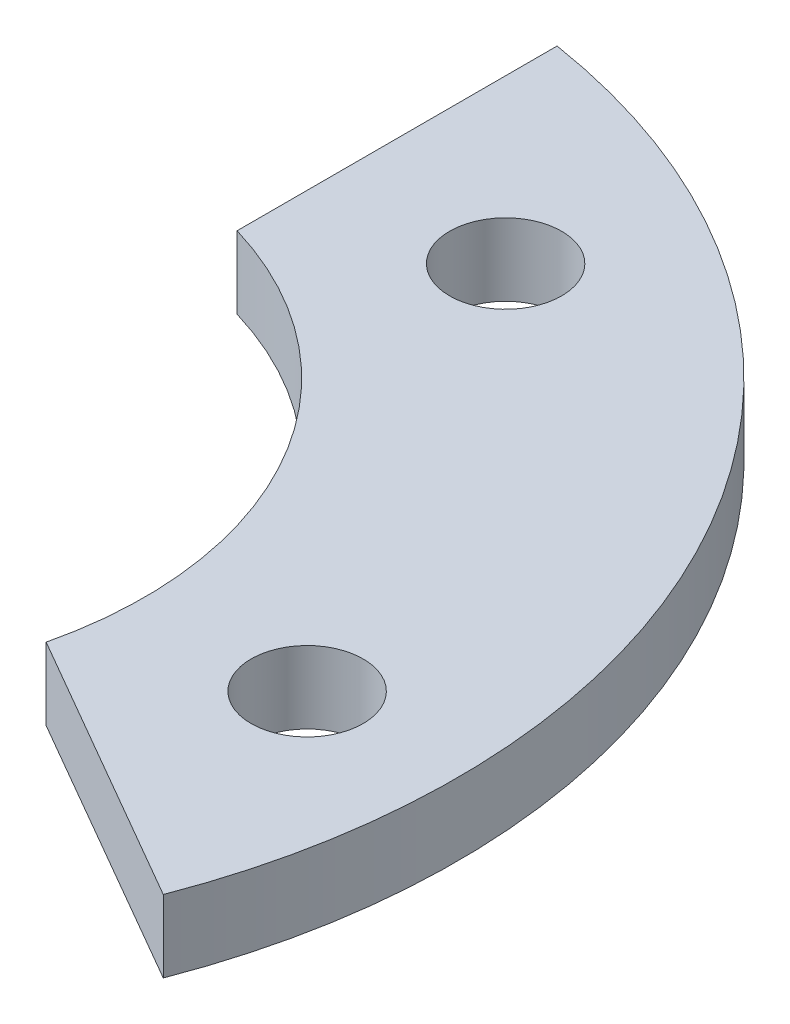
ISO-10303-21;
HEADER;
FILE_DESCRIPTION(('STEP AP214'),'2;1');
FILE_NAME('part.step','',(''),(''),'','','');
FILE_SCHEMA(('AUTOMOTIVE_DESIGN { 1 0 10303 214 1 1 1 1 }'));
ENDSEC;
DATA;
#1=APPLICATION_CONTEXT('core data for automotive mechanical design processes');
#2=APPLICATION_PROTOCOL_DEFINITION('international standard','automotive_design',2000,#1);
#3=PRODUCT_CONTEXT('',#1,'mechanical');
#4=PRODUCT('Part','Part','',(#3));
#5=PRODUCT_RELATED_PRODUCT_CATEGORY('part','',(#4));
#6=PRODUCT_DEFINITION_FORMATION('','',#4);
#7=PRODUCT_DEFINITION_CONTEXT('part definition',#1,'design');
#8=PRODUCT_DEFINITION('design','',#6,#7);
#9=PRODUCT_DEFINITION_SHAPE('','',#8);
#10=(LENGTH_UNIT() NAMED_UNIT(*) SI_UNIT(.MILLI.,.METRE.));
#11=(NAMED_UNIT(*) PLANE_ANGLE_UNIT() SI_UNIT($,.RADIAN.));
#12=(NAMED_UNIT(*) SI_UNIT($,.STERADIAN.) SOLID_ANGLE_UNIT());
#13=UNCERTAINTY_MEASURE_WITH_UNIT(LENGTH_MEASURE(1.E-05),#10,'distance_accuracy_value','');
#14=(GEOMETRIC_REPRESENTATION_CONTEXT(3) GLOBAL_UNCERTAINTY_ASSIGNED_CONTEXT((#13)) GLOBAL_UNIT_ASSIGNED_CONTEXT((#10,
#11,#12)) REPRESENTATION_CONTEXT('',''));
#15=CARTESIAN_POINT('',(0.,0.,0.));
#16=DIRECTION('',(0.,0.,1.));
#17=DIRECTION('',(1.,0.,0.));
#18=AXIS2_PLACEMENT_3D('',#15,#16,#17);
#19=CARTESIAN_POINT('',(0.,4.,0.));
#20=DIRECTION('',(0.,1.,0.));
#21=DIRECTION('',(0.,0.,1.));
#22=AXIS2_PLACEMENT_3D('',#19,#20,#21);
#23=PLANE('',#22);
#24=CARTESIAN_POINT('',(15.0000000000003,4.,-25.980762113533));
#25=DIRECTION('',(0.,1.,0.));
#26=DIRECTION('',(0.,0.,1.));
#27=AXIS2_PLACEMENT_3D('',#24,#25,#26);
#28=CIRCLE('',#27,3.1);
#29=CARTESIAN_POINT('',(15.0000000000003,4.,-22.880762113533));
#30=VERTEX_POINT('',#29);
#31=EDGE_CURVE('E104',#30,#30,#28,.T.);
#32=ORIENTED_EDGE('',*,*,#31,.F.);
#33=EDGE_LOOP('',(#32));
#34=FACE_BOUND('',#33,.T.);
#35=CARTESIAN_POINT('',(30.,4.,0.));
#36=DIRECTION('',(0.,1.,0.));
#37=DIRECTION('',(0.,0.,1.));
#38=AXIS2_PLACEMENT_3D('',#35,#36,#37);
#39=CIRCLE('',#38,3.09999999999999);
#40=CARTESIAN_POINT('',(30.,4.,3.09999999999999));
#41=VERTEX_POINT('',#40);
#42=EDGE_CURVE('E93',#41,#41,#39,.T.);
#43=ORIENTED_EDGE('',*,*,#42,.F.);
#44=EDGE_LOOP('',(#43));
#45=FACE_BOUND('',#44,.T.);
#46=CARTESIAN_POINT('',(0.,4.,0.));
#47=DIRECTION('',(0.,1.,0.));
#48=DIRECTION('',(0.,0.,1.));
#49=AXIS2_PLACEMENT_3D('',#46,#47,#48);
#50=CIRCLE('',#49,38.3);
#51=CARTESIAN_POINT('',(35.7592353390612,4.,13.7174009187469));
#52=VERTEX_POINT('',#51);
#53=CARTESIAN_POINT('',(6.,4.,-37.8271066829066));
#54=VERTEX_POINT('',#53);
#55=EDGE_CURVE('E84',#52,#54,#50,.T.);
#56=ORIENTED_EDGE('',*,*,#55,.T.);
#57=DIRECTION('',(0.,0.,1.));
#58=VECTOR('',#57,1.);
#59=CARTESIAN_POINT('',(6.,4.,-50.2763023357895));
#60=LINE('',#59,#58);
#61=CARTESIAN_POINT('',(6.,4.,-20.1246117974981));
#62=VERTEX_POINT('',#61);
#63=EDGE_CURVE('E87',#54,#62,#60,.T.);
#64=ORIENTED_EDGE('',*,*,#63,.T.);
#65=CARTESIAN_POINT('',(0.,4.,0.));
#66=DIRECTION('',(0.,1.,0.));
#67=DIRECTION('',(0.,0.,1.));
#68=AXIS2_PLACEMENT_3D('',#65,#66,#67);
#69=CIRCLE('',#68,21.);
#70=CARTESIAN_POINT('',(20.4284250579334,4.,4.86615347604252));
#71=VERTEX_POINT('',#70);
#72=EDGE_CURVE('E86',#71,#62,#69,.T.);
#73=ORIENTED_EDGE('',*,*,#72,.F.);
#74=DIRECTION('',(0.866025403784436,0.,0.500000000000004));
#75=VECTOR('',#74,1.);
#76=CARTESIAN_POINT('',(15.3820042044027,4.,1.95260103781242));
#77=LINE('',#76,#75);
#78=EDGE_CURVE('E55',#71,#52,#77,.T.);
#79=ORIENTED_EDGE('',*,*,#78,.T.);
#80=EDGE_LOOP('',(#56,#64,#73,#79));
#81=FACE_BOUND('',#80,.T.);
#82=ADVANCED_FACE('F33',(#34,#45,#81),#23,.T.);
#83=CARTESIAN_POINT('',(0.,0.,0.));
#84=DIRECTION('',(0.,1.,0.));
#85=DIRECTION('',(0.,0.,1.));
#86=AXIS2_PLACEMENT_3D('',#83,#84,#85);
#87=PLANE('',#86);
#88=CARTESIAN_POINT('',(15.0000000000003,0.,-25.980762113533));
#89=DIRECTION('',(0.,1.,0.));
#90=DIRECTION('',(0.,0.,1.));
#91=AXIS2_PLACEMENT_3D('',#88,#89,#90);
#92=CIRCLE('',#91,3.1);
#93=CARTESIAN_POINT('',(15.0000000000003,0.,-22.880762113533));
#94=VERTEX_POINT('',#93);
#95=EDGE_CURVE('E106',#94,#94,#92,.T.);
#96=ORIENTED_EDGE('',*,*,#95,.T.);
#97=EDGE_LOOP('',(#96));
#98=FACE_BOUND('',#97,.T.);
#99=CARTESIAN_POINT('',(30.,0.,0.));
#100=DIRECTION('',(0.,1.,0.));
#101=DIRECTION('',(0.,0.,1.));
#102=AXIS2_PLACEMENT_3D('',#99,#100,#101);
#103=CIRCLE('',#102,3.09999999999999);
#104=CARTESIAN_POINT('',(30.,0.,3.09999999999999));
#105=VERTEX_POINT('',#104);
#106=EDGE_CURVE('E96',#105,#105,#103,.T.);
#107=ORIENTED_EDGE('',*,*,#106,.T.);
#108=EDGE_LOOP('',(#107));
#109=FACE_BOUND('',#108,.T.);
#110=DIRECTION('',(0.,0.,1.));
#111=VECTOR('',#110,1.);
#112=CARTESIAN_POINT('',(6.00000000000001,0.,0.));
#113=LINE('',#112,#111);
#114=CARTESIAN_POINT('',(6.,0.,-37.8271066829066));
#115=VERTEX_POINT('',#114);
#116=CARTESIAN_POINT('',(6.,0.,-20.1246117974981));
#117=VERTEX_POINT('',#116);
#118=EDGE_CURVE('E48',#115,#117,#113,.T.);
#119=ORIENTED_EDGE('',*,*,#118,.F.);
#120=CARTESIAN_POINT('',(0.,0.,0.));
#121=DIRECTION('',(0.,1.,0.));
#122=DIRECTION('',(0.,0.,1.));
#123=AXIS2_PLACEMENT_3D('',#120,#121,#122);
#124=CIRCLE('',#123,38.3);
#125=CARTESIAN_POINT('',(35.7592353390612,0.,13.7174009187469));
#126=VERTEX_POINT('',#125);
#127=EDGE_CURVE('E91',#126,#115,#124,.T.);
#128=ORIENTED_EDGE('',*,*,#127,.F.);
#129=DIRECTION('',(0.866025403784436,0.,0.500000000000004));
#130=VECTOR('',#129,1.);
#131=CARTESIAN_POINT('',(3.00000000000002,0.,-5.19615242270662));
#132=LINE('',#131,#130);
#133=CARTESIAN_POINT('',(20.4284250579334,0.,4.86615347604252));
#134=VERTEX_POINT('',#133);
#135=EDGE_CURVE('E74',#134,#126,#132,.T.);
#136=ORIENTED_EDGE('',*,*,#135,.F.);
#137=CARTESIAN_POINT('',(0.,0.,0.));
#138=DIRECTION('',(0.,1.,0.));
#139=DIRECTION('',(0.,0.,1.));
#140=AXIS2_PLACEMENT_3D('',#137,#138,#139);
#141=CIRCLE('',#140,21.);
#142=EDGE_CURVE('E101',#134,#117,#141,.T.);
#143=ORIENTED_EDGE('',*,*,#142,.T.);
#144=EDGE_LOOP('',(#119,#128,#136,#143));
#145=FACE_BOUND('',#144,.T.);
#146=ADVANCED_FACE('F118',(#98,#109,#145),#87,.F.);
#147=CARTESIAN_POINT('',(0.,4.,0.));
#148=DIRECTION('',(0.,-1.,0.));
#149=DIRECTION('',(0.,0.,-1.));
#150=AXIS2_PLACEMENT_3D('',#147,#148,#149);
#151=CYLINDRICAL_SURFACE('',#150,38.3);
#152=DIRECTION('',(0.,-1.,0.));
#153=VECTOR('',#152,1.);
#154=CARTESIAN_POINT('',(6.,4.,-37.8271066829066));
#155=LINE('',#154,#153);
#156=EDGE_CURVE('E90',#54,#115,#155,.T.);
#157=ORIENTED_EDGE('',*,*,#156,.F.);
#158=ORIENTED_EDGE('',*,*,#55,.F.);
#159=DIRECTION('',(0.,-1.,0.));
#160=VECTOR('',#159,1.);
#161=CARTESIAN_POINT('',(35.7592353390612,4.,13.7174009187469));
#162=LINE('',#161,#160);
#163=EDGE_CURVE('E71',#126,#52,#162,.F.);
#164=ORIENTED_EDGE('',*,*,#163,.F.);
#165=ORIENTED_EDGE('',*,*,#127,.T.);
#166=EDGE_LOOP('',(#157,#158,#164,#165));
#167=FACE_BOUND('',#166,.T.);
#168=ADVANCED_FACE('F35',(#167),#151,.T.);
#169=CARTESIAN_POINT('',(0.,4.,0.));
#170=DIRECTION('',(0.,-1.,0.));
#171=DIRECTION('',(0.,0.,-1.));
#172=AXIS2_PLACEMENT_3D('',#169,#170,#171);
#173=CYLINDRICAL_SURFACE('',#172,21.);
#174=ORIENTED_EDGE('',*,*,#72,.T.);
#175=DIRECTION('',(0.,-1.,0.));
#176=VECTOR('',#175,1.);
#177=CARTESIAN_POINT('',(6.,4.,-20.1246117974981));
#178=LINE('',#177,#176);
#179=EDGE_CURVE('E11',#62,#117,#178,.T.);
#180=ORIENTED_EDGE('',*,*,#179,.T.);
#181=ORIENTED_EDGE('',*,*,#142,.F.);
#182=DIRECTION('',(0.,-1.,0.));
#183=VECTOR('',#182,1.);
#184=CARTESIAN_POINT('',(20.4284250579334,4.,4.86615347604252));
#185=LINE('',#184,#183);
#186=EDGE_CURVE('E41',#134,#71,#185,.F.);
#187=ORIENTED_EDGE('',*,*,#186,.T.);
#188=EDGE_LOOP('',(#174,#180,#181,#187));
#189=FACE_BOUND('',#188,.T.);
#190=ADVANCED_FACE('F115',(#189),#173,.F.);
#191=CARTESIAN_POINT('',(30.,4.,0.));
#192=DIRECTION('',(0.,-1.,0.));
#193=DIRECTION('',(0.,0.,-1.));
#194=AXIS2_PLACEMENT_3D('',#191,#192,#193);
#195=CYLINDRICAL_SURFACE('',#194,3.09999999999999);
#196=ORIENTED_EDGE('',*,*,#42,.T.);
#197=EDGE_LOOP('',(#196));
#198=FACE_BOUND('',#197,.T.);
#199=ORIENTED_EDGE('',*,*,#106,.F.);
#200=EDGE_LOOP('',(#199));
#201=FACE_BOUND('',#200,.T.);
#202=ADVANCED_FACE('F129',(#198,#201),#195,.F.);
#203=CARTESIAN_POINT('',(15.0000000000003,4.,-25.980762113533));
#204=DIRECTION('',(0.,-1.,0.));
#205=DIRECTION('',(0.,0.,-1.));
#206=AXIS2_PLACEMENT_3D('',#203,#204,#205);
#207=CYLINDRICAL_SURFACE('',#206,3.1);
#208=ORIENTED_EDGE('',*,*,#31,.T.);
#209=EDGE_LOOP('',(#208));
#210=FACE_BOUND('',#209,.T.);
#211=ORIENTED_EDGE('',*,*,#95,.F.);
#212=EDGE_LOOP('',(#211));
#213=FACE_BOUND('',#212,.T.);
#214=ADVANCED_FACE('F132',(#210,#213),#207,.F.);
#215=CARTESIAN_POINT('',(15.3820042044027,-6.,1.95260103781242));
#216=DIRECTION('',(-0.500000000000004,0.,0.866025403784436));
#217=DIRECTION('',(0.866025403784436,0.,0.500000000000004));
#218=AXIS2_PLACEMENT_3D('',#215,#216,#217);
#219=PLANE('',#218);
#220=ORIENTED_EDGE('',*,*,#163,.T.);
#221=ORIENTED_EDGE('',*,*,#78,.F.);
#222=ORIENTED_EDGE('',*,*,#186,.F.);
#223=ORIENTED_EDGE('',*,*,#135,.T.);
#224=EDGE_LOOP('',(#220,#221,#222,#223));
#225=FACE_BOUND('',#224,.T.);
#226=ADVANCED_FACE('F72',(#225),#219,.T.);
#227=CARTESIAN_POINT('',(6.,-6.,-50.2763023357895));
#228=DIRECTION('',(-1.,0.,0.));
#229=DIRECTION('',(0.,0.,1.));
#230=AXIS2_PLACEMENT_3D('',#227,#228,#229);
#231=PLANE('',#230);
#232=ORIENTED_EDGE('',*,*,#156,.T.);
#233=ORIENTED_EDGE('',*,*,#118,.T.);
#234=ORIENTED_EDGE('',*,*,#179,.F.);
#235=ORIENTED_EDGE('',*,*,#63,.F.);
#236=EDGE_LOOP('',(#232,#233,#234,#235));
#237=FACE_BOUND('',#236,.T.);
#238=ADVANCED_FACE('F141',(#237),#231,.T.);
#239=CLOSED_SHELL('',(#82,#146,#168,#190,#202,#214,#226,#238));
#240=MANIFOLD_SOLID_BREP('B2',#239);
#241=ADVANCED_BREP_SHAPE_REPRESENTATION('',(#18,#240),#14);
#242=SHAPE_DEFINITION_REPRESENTATION(#9,#241);
ENDSEC;
END-ISO-10303-21;
